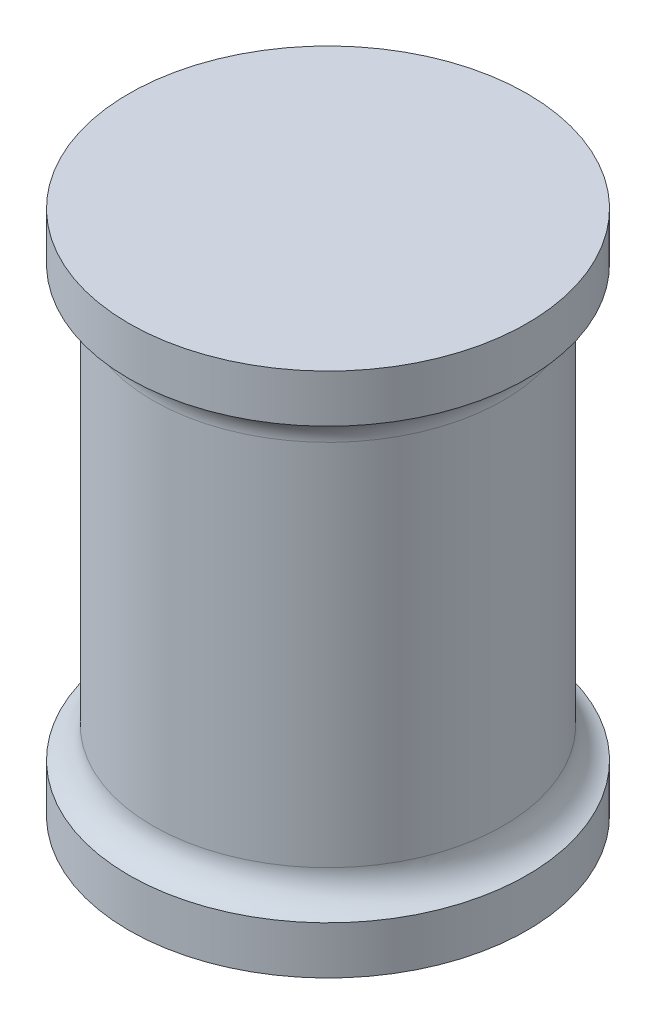
ISO-10303-21;
HEADER;
FILE_DESCRIPTION(('STEP AP214'),'2;1');
FILE_NAME('part.step','',(''),(''),'','','');
FILE_SCHEMA(('AUTOMOTIVE_DESIGN { 1 0 10303 214 1 1 1 1 }'));
ENDSEC;
DATA;
#1=APPLICATION_CONTEXT('core data for automotive mechanical design processes');
#2=APPLICATION_PROTOCOL_DEFINITION('international standard','automotive_design',2000,#1);
#3=PRODUCT_CONTEXT('',#1,'mechanical');
#4=PRODUCT('Part','Part','',(#3));
#5=PRODUCT_RELATED_PRODUCT_CATEGORY('part','',(#4));
#6=PRODUCT_DEFINITION_FORMATION('','',#4);
#7=PRODUCT_DEFINITION_CONTEXT('part definition',#1,'design');
#8=PRODUCT_DEFINITION('design','',#6,#7);
#9=PRODUCT_DEFINITION_SHAPE('','',#8);
#10=(LENGTH_UNIT() NAMED_UNIT(*) SI_UNIT(.MILLI.,.METRE.));
#11=(NAMED_UNIT(*) PLANE_ANGLE_UNIT() SI_UNIT($,.RADIAN.));
#12=(NAMED_UNIT(*) SI_UNIT($,.STERADIAN.) SOLID_ANGLE_UNIT());
#13=UNCERTAINTY_MEASURE_WITH_UNIT(LENGTH_MEASURE(1.E-05),#10,'distance_accuracy_value','');
#14=(GEOMETRIC_REPRESENTATION_CONTEXT(3) GLOBAL_UNCERTAINTY_ASSIGNED_CONTEXT((#13)) GLOBAL_UNIT_ASSIGNED_CONTEXT((#10,
#11,#12)) REPRESENTATION_CONTEXT('',''));
#15=CARTESIAN_POINT('',(0.,0.,0.));
#16=DIRECTION('',(0.,0.,1.));
#17=DIRECTION('',(1.,0.,0.));
#18=AXIS2_PLACEMENT_3D('',#15,#16,#17);
#19=CARTESIAN_POINT('',(0.,33.,0.));
#20=DIRECTION('',(0.,-1.,0.));
#21=DIRECTION('',(0.,0.,-1.));
#22=AXIS2_PLACEMENT_3D('',#19,#20,#21);
#23=CYLINDRICAL_SURFACE('',#22,11.);
#24=CARTESIAN_POINT('',(0.,28.0635083268963,0.));
#25=DIRECTION('',(0.,1.,0.));
#26=DIRECTION('',(0.,0.,1.));
#27=AXIS2_PLACEMENT_3D('',#24,#25,#26);
#28=CIRCLE('',#27,11.);
#29=CARTESIAN_POINT('',(0.,28.0635083268963,11.));
#30=VERTEX_POINT('',#29);
#31=EDGE_CURVE('E11',#30,#30,#28,.F.);
#32=ORIENTED_EDGE('',*,*,#31,.T.);
#33=EDGE_LOOP('',(#32));
#34=FACE_BOUND('',#33,.T.);
#35=CARTESIAN_POINT('',(0.,4.93649167310371,0.));
#36=DIRECTION('',(0.,-1.,0.));
#37=DIRECTION('',(0.,0.,-1.));
#38=AXIS2_PLACEMENT_3D('',#35,#36,#37);
#39=CIRCLE('',#38,11.);
#40=CARTESIAN_POINT('',(0.,4.93649167310371,-11.));
#41=VERTEX_POINT('',#40);
#42=EDGE_CURVE('E45',#41,#41,#39,.F.);
#43=ORIENTED_EDGE('',*,*,#42,.T.);
#44=EDGE_LOOP('',(#43));
#45=FACE_BOUND('',#44,.T.);
#46=ADVANCED_FACE('F37',(#34,#45),#23,.T.);
#47=CARTESIAN_POINT('',(0.,-2.,-2.02225389211996E-12));
#48=DIRECTION('',(0.,1.,0.));
#49=DIRECTION('',(0.,0.,1.));
#50=AXIS2_PLACEMENT_3D('',#47,#48,#49);
#51=CYLINDRICAL_SURFACE('',#50,1.755);
#52=DIRECTION('',(0.,1.,0.));
#53=VECTOR('',#52,1.);
#54=CARTESIAN_POINT('',(1.07743831409072,-2.,-1.38533450088231));
#55=LINE('',#54,#53);
#56=CARTESIAN_POINT('',(1.07743831409072,0.,-1.38533450088231));
#57=VERTEX_POINT('',#56);
#58=CARTESIAN_POINT('',(1.07743831409072,9.,-1.38533450088231));
#59=VERTEX_POINT('',#58);
#60=EDGE_CURVE('E59',#57,#59,#55,.T.);
#61=ORIENTED_EDGE('',*,*,#60,.F.);
#62=CARTESIAN_POINT('',(0.,0.,-2.02203705168547E-12));
#63=DIRECTION('',(0.,-1.,0.));
#64=DIRECTION('',(0.,0.,1.));
#65=AXIS2_PLACEMENT_3D('',#62,#63,#64);
#66=CIRCLE('',#65,1.755);
#67=CARTESIAN_POINT('',(-1.07743831409082,0.,-1.38533450088231));
#68=VERTEX_POINT('',#67);
#69=EDGE_CURVE('E65',#57,#68,#66,.T.);
#70=ORIENTED_EDGE('',*,*,#69,.T.);
#71=DIRECTION('',(0.,1.,0.));
#72=VECTOR('',#71,1.);
#73=CARTESIAN_POINT('',(-1.07743831409082,-2.,-1.38533450088231));
#74=LINE('',#73,#72);
#75=CARTESIAN_POINT('',(-1.07743831409082,9.,-1.38533450088231));
#76=VERTEX_POINT('',#75);
#77=EDGE_CURVE('E52',#68,#76,#74,.T.);
#78=ORIENTED_EDGE('',*,*,#77,.T.);
#79=CARTESIAN_POINT('',(0.,9.,-2.02225389211996E-12));
#80=DIRECTION('',(0.,1.,0.));
#81=DIRECTION('',(0.,0.,1.));
#82=AXIS2_PLACEMENT_3D('',#79,#80,#81);
#83=CIRCLE('',#82,1.755);
#84=EDGE_CURVE('E68',#59,#76,#83,.F.);
#85=ORIENTED_EDGE('',*,*,#84,.F.);
#86=EDGE_LOOP('',(#61,#70,#78,#85));
#87=FACE_BOUND('',#86,.T.);
#88=ADVANCED_FACE('F63',(#87),#51,.F.);
#89=CARTESIAN_POINT('',(-1.07743831409082,-2.,-1.38533450088231));
#90=DIRECTION('',(0.,0.,-1.));
#91=DIRECTION('',(-1.,0.,0.));
#92=AXIS2_PLACEMENT_3D('',#89,#90,#91);
#93=PLANE('',#92);
#94=ORIENTED_EDGE('',*,*,#77,.F.);
#95=DIRECTION('',(1.,0.,0.));
#96=VECTOR('',#95,1.);
#97=CARTESIAN_POINT('',(-1.07743831409082,0.,-1.38533450088231));
#98=LINE('',#97,#96);
#99=EDGE_CURVE('E71',#68,#57,#98,.T.);
#100=ORIENTED_EDGE('',*,*,#99,.T.);
#101=ORIENTED_EDGE('',*,*,#60,.T.);
#102=DIRECTION('',(1.,0.,0.));
#103=VECTOR('',#102,1.);
#104=CARTESIAN_POINT('',(-1.07743831409082,9.,-1.38533450088231));
#105=LINE('',#104,#103);
#106=EDGE_CURVE('E90',#76,#59,#105,.T.);
#107=ORIENTED_EDGE('',*,*,#106,.F.);
#108=EDGE_LOOP('',(#94,#100,#101,#107));
#109=FACE_BOUND('',#108,.T.);
#110=ADVANCED_FACE('F72',(#109),#93,.F.);
#111=CARTESIAN_POINT('',(0.,9.,0.));
#112=DIRECTION('',(0.,1.,0.));
#113=DIRECTION('',(0.,0.,1.));
#114=AXIS2_PLACEMENT_3D('',#111,#112,#113);
#115=PLANE('',#114);
#116=ORIENTED_EDGE('',*,*,#106,.T.);
#117=ORIENTED_EDGE('',*,*,#84,.T.);
#118=EDGE_LOOP('',(#116,#117));
#119=FACE_BOUND('',#118,.T.);
#120=ADVANCED_FACE('F124',(#119),#115,.F.);
#121=CARTESIAN_POINT('',(0.,0.,-2.02203705168547E-12));
#122=DIRECTION('',(0.,-1.,0.));
#123=DIRECTION('',(0.,0.,-1.));
#124=AXIS2_PLACEMENT_3D('',#121,#122,#123);
#125=PLANE('',#124);
#126=CARTESIAN_POINT('',(0.,0.,-2.02203705168547E-12));
#127=DIRECTION('',(0.,-1.,0.));
#128=DIRECTION('',(0.,0.,-1.));
#129=AXIS2_PLACEMENT_3D('',#126,#127,#128);
#130=CIRCLE('',#129,12.5);
#131=CARTESIAN_POINT('',(0.,0.,-12.500000000002));
#132=VERTEX_POINT('',#131);
#133=EDGE_CURVE('E84',#132,#132,#130,.T.);
#134=ORIENTED_EDGE('',*,*,#133,.T.);
#135=EDGE_LOOP('',(#134));
#136=FACE_BOUND('',#135,.T.);
#137=ORIENTED_EDGE('',*,*,#99,.F.);
#138=ORIENTED_EDGE('',*,*,#69,.F.);
#139=EDGE_LOOP('',(#137,#138));
#140=FACE_BOUND('',#139,.T.);
#141=ADVANCED_FACE('F76',(#136,#140),#125,.T.);
#142=CARTESIAN_POINT('',(0.,0.,-2.02203705168547E-12));
#143=DIRECTION('',(0.,1.,0.));
#144=DIRECTION('',(0.,0.,1.));
#145=AXIS2_PLACEMENT_3D('',#142,#143,#144);
#146=CYLINDRICAL_SURFACE('',#145,12.5);
#147=ORIENTED_EDGE('',*,*,#133,.F.);
#148=EDGE_LOOP('',(#147));
#149=FACE_BOUND('',#148,.T.);
#150=CARTESIAN_POINT('',(0.,3.,-2.02203705168547E-12));
#151=DIRECTION('',(0.,-1.,0.));
#152=DIRECTION('',(0.,0.,-1.));
#153=AXIS2_PLACEMENT_3D('',#150,#151,#152);
#154=CIRCLE('',#153,12.5);
#155=CARTESIAN_POINT('',(0.,3.,-12.500000000002));
#156=VERTEX_POINT('',#155);
#157=EDGE_CURVE('E74',#156,#156,#154,.T.);
#158=ORIENTED_EDGE('',*,*,#157,.T.);
#159=EDGE_LOOP('',(#158));
#160=FACE_BOUND('',#159,.T.);
#161=ADVANCED_FACE('F99',(#149,#160),#146,.T.);
#162=CARTESIAN_POINT('',(0.,4.93649167310371,-2.02203705168547E-12));
#163=DIRECTION('',(0.,-1.,0.));
#164=DIRECTION('',(0.,0.,-1.));
#165=AXIS2_PLACEMENT_3D('',#162,#163,#164);
#166=TOROIDAL_SURFACE('',#165,13.,2.);
#167=ORIENTED_EDGE('',*,*,#157,.F.);
#168=EDGE_LOOP('',(#167));
#169=FACE_BOUND('',#168,.T.);
#170=ORIENTED_EDGE('',*,*,#42,.F.);
#171=EDGE_LOOP('',(#170));
#172=FACE_BOUND('',#171,.T.);
#173=ADVANCED_FACE('F96',(#169,#172),#166,.F.);
#174=CARTESIAN_POINT('',(0.,30.,0.));
#175=DIRECTION('',(0.,1.,0.));
#176=DIRECTION('',(0.,0.,1.));
#177=AXIS2_PLACEMENT_3D('',#174,#175,#176);
#178=CYLINDRICAL_SURFACE('',#177,12.5);
#179=CARTESIAN_POINT('',(0.,30.,0.));
#180=DIRECTION('',(0.,1.,0.));
#181=DIRECTION('',(0.,0.,1.));
#182=AXIS2_PLACEMENT_3D('',#179,#180,#181);
#183=CIRCLE('',#182,12.5);
#184=CARTESIAN_POINT('',(0.,30.,12.5));
#185=VERTEX_POINT('',#184);
#186=EDGE_CURVE('E77',#185,#185,#183,.T.);
#187=ORIENTED_EDGE('',*,*,#186,.T.);
#188=EDGE_LOOP('',(#187));
#189=FACE_BOUND('',#188,.T.);
#190=CARTESIAN_POINT('',(0.,33.,0.));
#191=DIRECTION('',(0.,1.,0.));
#192=DIRECTION('',(0.,0.,1.));
#193=AXIS2_PLACEMENT_3D('',#190,#191,#192);
#194=CIRCLE('',#193,12.5);
#195=CARTESIAN_POINT('',(0.,33.,12.5));
#196=VERTEX_POINT('',#195);
#197=EDGE_CURVE('E80',#196,#196,#194,.T.);
#198=ORIENTED_EDGE('',*,*,#197,.F.);
#199=EDGE_LOOP('',(#198));
#200=FACE_BOUND('',#199,.T.);
#201=ADVANCED_FACE('F98',(#189,#200),#178,.T.);
#202=CARTESIAN_POINT('',(0.,33.,0.));
#203=DIRECTION('',(0.,1.,0.));
#204=DIRECTION('',(0.,0.,1.));
#205=AXIS2_PLACEMENT_3D('',#202,#203,#204);
#206=PLANE('',#205);
#207=ORIENTED_EDGE('',*,*,#197,.T.);
#208=EDGE_LOOP('',(#207));
#209=FACE_BOUND('',#208,.T.);
#210=ADVANCED_FACE('F105',(#209),#206,.T.);
#211=CARTESIAN_POINT('',(0.,28.0635083268963,0.));
#212=DIRECTION('',(0.,1.,0.));
#213=DIRECTION('',(0.,0.,1.));
#214=AXIS2_PLACEMENT_3D('',#211,#212,#213);
#215=TOROIDAL_SURFACE('',#214,13.,2.);
#216=ORIENTED_EDGE('',*,*,#31,.F.);
#217=EDGE_LOOP('',(#216));
#218=FACE_BOUND('',#217,.T.);
#219=ORIENTED_EDGE('',*,*,#186,.F.);
#220=EDGE_LOOP('',(#219));
#221=FACE_BOUND('',#220,.T.);
#222=ADVANCED_FACE('F39',(#218,#221),#215,.F.);
#223=CLOSED_SHELL('',(#46,#88,#110,#120,#141,#161,#173,#201,#210,#222));
#224=MANIFOLD_SOLID_BREP('B2',#223);
#225=ADVANCED_BREP_SHAPE_REPRESENTATION('',(#18,#224),#14);
#226=SHAPE_DEFINITION_REPRESENTATION(#9,#225);
ENDSEC;
END-ISO-10303-21;
